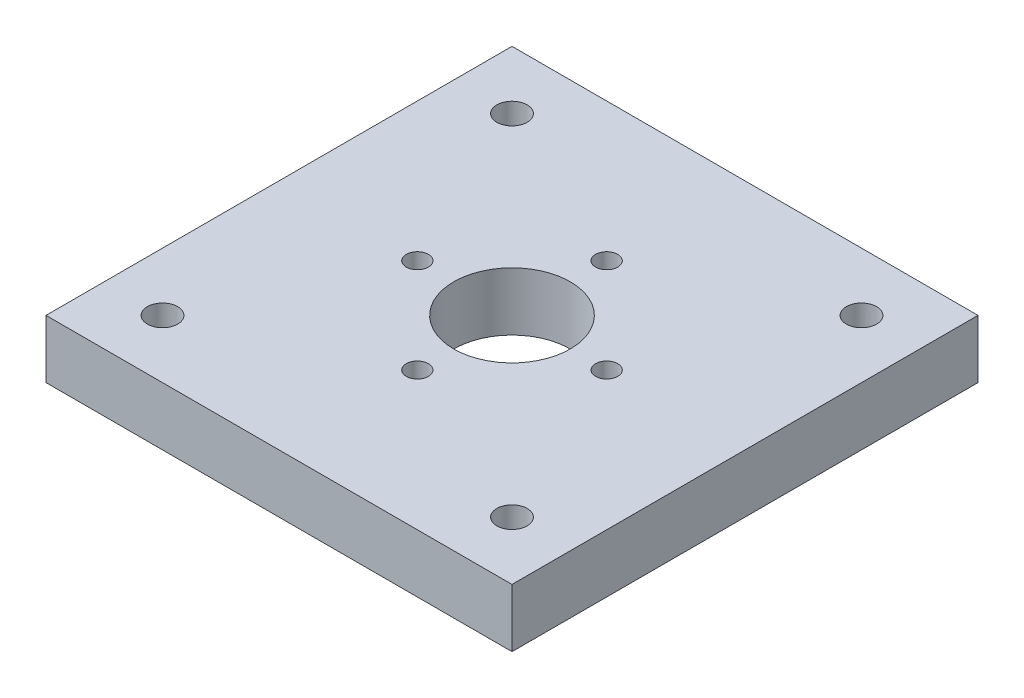
ISO-10303-21;
HEADER;
FILE_DESCRIPTION(('STEP AP214'),'2;1');
FILE_NAME('part.step','',(''),(''),'','','');
FILE_SCHEMA(('AUTOMOTIVE_DESIGN { 1 0 10303 214 1 1 1 1 }'));
ENDSEC;
DATA;
#1=APPLICATION_CONTEXT('core data for automotive mechanical design processes');
#2=APPLICATION_PROTOCOL_DEFINITION('international standard','automotive_design',2000,#1);
#3=PRODUCT_CONTEXT('',#1,'mechanical');
#4=PRODUCT('Part','Part','',(#3));
#5=PRODUCT_RELATED_PRODUCT_CATEGORY('part','',(#4));
#6=PRODUCT_DEFINITION_FORMATION('','',#4);
#7=PRODUCT_DEFINITION_CONTEXT('part definition',#1,'design');
#8=PRODUCT_DEFINITION('design','',#6,#7);
#9=PRODUCT_DEFINITION_SHAPE('','',#8);
#10=(LENGTH_UNIT() NAMED_UNIT(*) SI_UNIT(.MILLI.,.METRE.));
#11=(NAMED_UNIT(*) PLANE_ANGLE_UNIT() SI_UNIT($,.RADIAN.));
#12=(NAMED_UNIT(*) SI_UNIT($,.STERADIAN.) SOLID_ANGLE_UNIT());
#13=UNCERTAINTY_MEASURE_WITH_UNIT(LENGTH_MEASURE(1.E-05),#10,'distance_accuracy_value','');
#14=(GEOMETRIC_REPRESENTATION_CONTEXT(3) GLOBAL_UNCERTAINTY_ASSIGNED_CONTEXT((#13)) GLOBAL_UNIT_ASSIGNED_CONTEXT((#10,
#11,#12)) REPRESENTATION_CONTEXT('',''));
#15=CARTESIAN_POINT('',(0.,0.,0.));
#16=DIRECTION('',(0.,0.,1.));
#17=DIRECTION('',(1.,0.,0.));
#18=AXIS2_PLACEMENT_3D('',#15,#16,#17);
#19=CARTESIAN_POINT('',(0.,0.5,0.));
#20=DIRECTION('',(0.,1.,0.));
#21=DIRECTION('',(0.,0.,1.));
#22=AXIS2_PLACEMENT_3D('',#19,#20,#21);
#23=PLANE('',#22);
#24=CARTESIAN_POINT('',(0.,0.5,0.8125));
#25=DIRECTION('',(0.,1.,0.));
#26=DIRECTION('',(0.,0.,1.));
#27=AXIS2_PLACEMENT_3D('',#24,#25,#26);
#28=CIRCLE('',#27,0.095);
#29=CARTESIAN_POINT('',(0.,0.5,0.9075));
#30=VERTEX_POINT('',#29);
#31=EDGE_CURVE('E155',#30,#30,#28,.T.);
#32=ORIENTED_EDGE('',*,*,#31,.F.);
#33=EDGE_LOOP('',(#32));
#34=FACE_BOUND('',#33,.T.);
#35=CARTESIAN_POINT('',(0.,0.5,-0.8125));
#36=DIRECTION('',(0.,1.,0.));
#37=DIRECTION('',(0.,0.,1.));
#38=AXIS2_PLACEMENT_3D('',#35,#36,#37);
#39=CIRCLE('',#38,0.095);
#40=CARTESIAN_POINT('',(0.,0.5,-0.7175));
#41=VERTEX_POINT('',#40);
#42=EDGE_CURVE('E143',#41,#41,#39,.T.);
#43=ORIENTED_EDGE('',*,*,#42,.F.);
#44=EDGE_LOOP('',(#43));
#45=FACE_BOUND('',#44,.T.);
#46=CARTESIAN_POINT('',(1.5,0.5,-1.5));
#47=DIRECTION('',(0.,1.,0.));
#48=DIRECTION('',(0.,0.,-1.));
#49=AXIS2_PLACEMENT_3D('',#46,#47,#48);
#50=CIRCLE('',#49,0.13);
#51=CARTESIAN_POINT('',(1.5,0.5,-1.63));
#52=VERTEX_POINT('',#51);
#53=EDGE_CURVE('E131',#52,#52,#50,.T.);
#54=ORIENTED_EDGE('',*,*,#53,.F.);
#55=EDGE_LOOP('',(#54));
#56=FACE_BOUND('',#55,.T.);
#57=CARTESIAN_POINT('',(-1.5,0.5,1.5));
#58=DIRECTION('',(0.,1.,0.));
#59=DIRECTION('',(0.,0.,1.));
#60=AXIS2_PLACEMENT_3D('',#57,#58,#59);
#61=CIRCLE('',#60,0.13);
#62=CARTESIAN_POINT('',(-1.5,0.5,1.63));
#63=VERTEX_POINT('',#62);
#64=EDGE_CURVE('E119',#63,#63,#61,.T.);
#65=ORIENTED_EDGE('',*,*,#64,.F.);
#66=EDGE_LOOP('',(#65));
#67=FACE_BOUND('',#66,.T.);
#68=DIRECTION('',(0.,0.,-1.));
#69=VECTOR('',#68,1.);
#70=CARTESIAN_POINT('',(2.,0.5,-2.));
#71=LINE('',#70,#69);
#72=CARTESIAN_POINT('',(2.,0.5,2.));
#73=VERTEX_POINT('',#72);
#74=CARTESIAN_POINT('',(2.,0.5,-2.));
#75=VERTEX_POINT('',#74);
#76=EDGE_CURVE('E89',#73,#75,#71,.T.);
#77=ORIENTED_EDGE('',*,*,#76,.T.);
#78=DIRECTION('',(-1.,0.,0.));
#79=VECTOR('',#78,1.);
#80=CARTESIAN_POINT('',(-2.,0.5,-2.));
#81=LINE('',#80,#79);
#82=CARTESIAN_POINT('',(-2.,0.5,-2.));
#83=VERTEX_POINT('',#82);
#84=EDGE_CURVE('E84',#75,#83,#81,.T.);
#85=ORIENTED_EDGE('',*,*,#84,.T.);
#86=DIRECTION('',(0.,0.,1.));
#87=VECTOR('',#86,1.);
#88=CARTESIAN_POINT('',(-2.,0.5,-2.));
#89=LINE('',#88,#87);
#90=CARTESIAN_POINT('',(-2.,0.5,2.));
#91=VERTEX_POINT('',#90);
#92=EDGE_CURVE('E87',#83,#91,#89,.T.);
#93=ORIENTED_EDGE('',*,*,#92,.T.);
#94=DIRECTION('',(1.,0.,0.));
#95=VECTOR('',#94,1.);
#96=CARTESIAN_POINT('',(-2.,0.5,2.));
#97=LINE('',#96,#95);
#98=EDGE_CURVE('E54',#91,#73,#97,.T.);
#99=ORIENTED_EDGE('',*,*,#98,.T.);
#100=EDGE_LOOP('',(#77,#85,#93,#99));
#101=FACE_BOUND('',#100,.T.);
#102=CARTESIAN_POINT('',(-1.5,0.5,-1.5));
#103=DIRECTION('',(0.,1.,0.));
#104=DIRECTION('',(0.,0.,1.));
#105=AXIS2_PLACEMENT_3D('',#102,#103,#104);
#106=CIRCLE('',#105,0.13);
#107=CARTESIAN_POINT('',(-1.5,0.5,-1.37));
#108=VERTEX_POINT('',#107);
#109=EDGE_CURVE('E104',#108,#108,#106,.T.);
#110=ORIENTED_EDGE('',*,*,#109,.F.);
#111=EDGE_LOOP('',(#110));
#112=FACE_BOUND('',#111,.T.);
#113=CARTESIAN_POINT('',(1.5,0.5,1.5));
#114=DIRECTION('',(0.,1.,0.));
#115=DIRECTION('',(0.,0.,-1.));
#116=AXIS2_PLACEMENT_3D('',#113,#114,#115);
#117=CIRCLE('',#116,0.13);
#118=CARTESIAN_POINT('',(1.5,0.5,1.37));
#119=VERTEX_POINT('',#118);
#120=EDGE_CURVE('E125',#119,#119,#117,.T.);
#121=ORIENTED_EDGE('',*,*,#120,.F.);
#122=EDGE_LOOP('',(#121));
#123=FACE_BOUND('',#122,.T.);
#124=CARTESIAN_POINT('',(0.,0.5,0.));
#125=DIRECTION('',(0.,1.,0.));
#126=DIRECTION('',(0.,0.,1.));
#127=AXIS2_PLACEMENT_3D('',#124,#125,#126);
#128=CIRCLE('',#127,0.5);
#129=CARTESIAN_POINT('',(0.,0.5,0.5));
#130=VERTEX_POINT('',#129);
#131=EDGE_CURVE('E137',#130,#130,#128,.T.);
#132=ORIENTED_EDGE('',*,*,#131,.F.);
#133=EDGE_LOOP('',(#132));
#134=FACE_BOUND('',#133,.T.);
#135=CARTESIAN_POINT('',(0.8125,0.5,0.));
#136=DIRECTION('',(0.,1.,0.));
#137=DIRECTION('',(0.,0.,1.));
#138=AXIS2_PLACEMENT_3D('',#135,#136,#137);
#139=CIRCLE('',#138,0.095);
#140=CARTESIAN_POINT('',(0.8125,0.5,0.0950000000000028));
#141=VERTEX_POINT('',#140);
#142=EDGE_CURVE('E149',#141,#141,#139,.T.);
#143=ORIENTED_EDGE('',*,*,#142,.F.);
#144=EDGE_LOOP('',(#143));
#145=FACE_BOUND('',#144,.T.);
#146=CARTESIAN_POINT('',(-0.8125,0.5,0.));
#147=DIRECTION('',(0.,1.,0.));
#148=DIRECTION('',(0.,0.,1.));
#149=AXIS2_PLACEMENT_3D('',#146,#147,#148);
#150=CIRCLE('',#149,0.095);
#151=CARTESIAN_POINT('',(-0.8125,0.5,0.0949999999999915));
#152=VERTEX_POINT('',#151);
#153=EDGE_CURVE('E161',#152,#152,#150,.T.);
#154=ORIENTED_EDGE('',*,*,#153,.F.);
#155=EDGE_LOOP('',(#154));
#156=FACE_BOUND('',#155,.T.);
#157=ADVANCED_FACE('F37',(#34,#45,#56,#67,#101,#112,#123,#134,#145,#156),#23,.T.);
#158=CARTESIAN_POINT('',(0.,0.,0.));
#159=DIRECTION('',(0.,1.,0.));
#160=DIRECTION('',(0.,0.,1.));
#161=AXIS2_PLACEMENT_3D('',#158,#159,#160);
#162=PLANE('',#161);
#163=DIRECTION('',(0.,0.,-1.));
#164=VECTOR('',#163,1.);
#165=CARTESIAN_POINT('',(2.,0.,-2.));
#166=LINE('',#165,#164);
#167=CARTESIAN_POINT('',(2.,0.,2.));
#168=VERTEX_POINT('',#167);
#169=CARTESIAN_POINT('',(2.,0.,-2.));
#170=VERTEX_POINT('',#169);
#171=EDGE_CURVE('E101',#168,#170,#166,.T.);
#172=ORIENTED_EDGE('',*,*,#171,.F.);
#173=DIRECTION('',(1.,0.,0.));
#174=VECTOR('',#173,1.);
#175=CARTESIAN_POINT('',(-2.,0.,2.));
#176=LINE('',#175,#174);
#177=CARTESIAN_POINT('',(-2.,0.,2.));
#178=VERTEX_POINT('',#177);
#179=EDGE_CURVE('E77',#178,#168,#176,.T.);
#180=ORIENTED_EDGE('',*,*,#179,.F.);
#181=DIRECTION('',(0.,0.,1.));
#182=VECTOR('',#181,1.);
#183=CARTESIAN_POINT('',(-2.,0.,-2.));
#184=LINE('',#183,#182);
#185=CARTESIAN_POINT('',(-2.,0.,-2.));
#186=VERTEX_POINT('',#185);
#187=EDGE_CURVE('E71',#186,#178,#184,.T.);
#188=ORIENTED_EDGE('',*,*,#187,.F.);
#189=DIRECTION('',(-1.,0.,0.));
#190=VECTOR('',#189,1.);
#191=CARTESIAN_POINT('',(-2.,0.,-2.));
#192=LINE('',#191,#190);
#193=EDGE_CURVE('E93',#170,#186,#192,.T.);
#194=ORIENTED_EDGE('',*,*,#193,.F.);
#195=EDGE_LOOP('',(#172,#180,#188,#194));
#196=FACE_BOUND('',#195,.T.);
#197=CARTESIAN_POINT('',(-1.5,0.,-1.5));
#198=DIRECTION('',(0.,1.,0.));
#199=DIRECTION('',(0.,0.,1.));
#200=AXIS2_PLACEMENT_3D('',#197,#198,#199);
#201=CIRCLE('',#200,0.13);
#202=CARTESIAN_POINT('',(-1.5,0.,-1.37));
#203=VERTEX_POINT('',#202);
#204=EDGE_CURVE('E116',#203,#203,#201,.T.);
#205=ORIENTED_EDGE('',*,*,#204,.T.);
#206=EDGE_LOOP('',(#205));
#207=FACE_BOUND('',#206,.T.);
#208=CARTESIAN_POINT('',(-1.5,0.,1.5));
#209=DIRECTION('',(0.,1.,0.));
#210=DIRECTION('',(0.,0.,1.));
#211=AXIS2_PLACEMENT_3D('',#208,#209,#210);
#212=CIRCLE('',#211,0.13);
#213=CARTESIAN_POINT('',(-1.5,0.,1.63));
#214=VERTEX_POINT('',#213);
#215=EDGE_CURVE('E122',#214,#214,#212,.T.);
#216=ORIENTED_EDGE('',*,*,#215,.T.);
#217=EDGE_LOOP('',(#216));
#218=FACE_BOUND('',#217,.T.);
#219=CARTESIAN_POINT('',(1.5,0.,1.5));
#220=DIRECTION('',(0.,1.,0.));
#221=DIRECTION('',(0.,0.,-1.));
#222=AXIS2_PLACEMENT_3D('',#219,#220,#221);
#223=CIRCLE('',#222,0.13);
#224=CARTESIAN_POINT('',(1.5,0.,1.37));
#225=VERTEX_POINT('',#224);
#226=EDGE_CURVE('E128',#225,#225,#223,.T.);
#227=ORIENTED_EDGE('',*,*,#226,.T.);
#228=EDGE_LOOP('',(#227));
#229=FACE_BOUND('',#228,.T.);
#230=CARTESIAN_POINT('',(1.5,0.,-1.5));
#231=DIRECTION('',(0.,1.,0.));
#232=DIRECTION('',(0.,0.,-1.));
#233=AXIS2_PLACEMENT_3D('',#230,#231,#232);
#234=CIRCLE('',#233,0.13);
#235=CARTESIAN_POINT('',(1.5,0.,-1.63));
#236=VERTEX_POINT('',#235);
#237=EDGE_CURVE('E134',#236,#236,#234,.T.);
#238=ORIENTED_EDGE('',*,*,#237,.T.);
#239=EDGE_LOOP('',(#238));
#240=FACE_BOUND('',#239,.T.);
#241=CARTESIAN_POINT('',(0.,0.,0.));
#242=DIRECTION('',(0.,1.,0.));
#243=DIRECTION('',(0.,0.,1.));
#244=AXIS2_PLACEMENT_3D('',#241,#242,#243);
#245=CIRCLE('',#244,0.5);
#246=CARTESIAN_POINT('',(0.,0.,0.5));
#247=VERTEX_POINT('',#246);
#248=EDGE_CURVE('E140',#247,#247,#245,.T.);
#249=ORIENTED_EDGE('',*,*,#248,.T.);
#250=EDGE_LOOP('',(#249));
#251=FACE_BOUND('',#250,.T.);
#252=CARTESIAN_POINT('',(0.,0.,-0.8125));
#253=DIRECTION('',(0.,1.,0.));
#254=DIRECTION('',(0.,0.,1.));
#255=AXIS2_PLACEMENT_3D('',#252,#253,#254);
#256=CIRCLE('',#255,0.095);
#257=CARTESIAN_POINT('',(0.,0.,-0.7175));
#258=VERTEX_POINT('',#257);
#259=EDGE_CURVE('E146',#258,#258,#256,.T.);
#260=ORIENTED_EDGE('',*,*,#259,.T.);
#261=EDGE_LOOP('',(#260));
#262=FACE_BOUND('',#261,.T.);
#263=CARTESIAN_POINT('',(0.8125,0.,0.));
#264=DIRECTION('',(0.,1.,0.));
#265=DIRECTION('',(0.,0.,1.));
#266=AXIS2_PLACEMENT_3D('',#263,#264,#265);
#267=CIRCLE('',#266,0.095);
#268=CARTESIAN_POINT('',(0.8125,0.,0.0950000000000028));
#269=VERTEX_POINT('',#268);
#270=EDGE_CURVE('E152',#269,#269,#267,.T.);
#271=ORIENTED_EDGE('',*,*,#270,.T.);
#272=EDGE_LOOP('',(#271));
#273=FACE_BOUND('',#272,.T.);
#274=CARTESIAN_POINT('',(0.,0.,0.8125));
#275=DIRECTION('',(0.,1.,0.));
#276=DIRECTION('',(0.,0.,1.));
#277=AXIS2_PLACEMENT_3D('',#274,#275,#276);
#278=CIRCLE('',#277,0.095);
#279=CARTESIAN_POINT('',(0.,0.,0.9075));
#280=VERTEX_POINT('',#279);
#281=EDGE_CURVE('E158',#280,#280,#278,.T.);
#282=ORIENTED_EDGE('',*,*,#281,.T.);
#283=EDGE_LOOP('',(#282));
#284=FACE_BOUND('',#283,.T.);
#285=CARTESIAN_POINT('',(-0.8125,0.,0.));
#286=DIRECTION('',(0.,1.,0.));
#287=DIRECTION('',(0.,0.,1.));
#288=AXIS2_PLACEMENT_3D('',#285,#286,#287);
#289=CIRCLE('',#288,0.095);
#290=CARTESIAN_POINT('',(-0.8125,0.,0.0949999999999915));
#291=VERTEX_POINT('',#290);
#292=EDGE_CURVE('E164',#291,#291,#289,.T.);
#293=ORIENTED_EDGE('',*,*,#292,.T.);
#294=EDGE_LOOP('',(#293));
#295=FACE_BOUND('',#294,.T.);
#296=ADVANCED_FACE('F112',(#196,#207,#218,#229,#240,#251,#262,#273,#284,#295),#162,.F.);
#297=CARTESIAN_POINT('',(2.,0.5,-2.));
#298=DIRECTION('',(-1.,0.,0.));
#299=DIRECTION('',(0.,0.,1.));
#300=AXIS2_PLACEMENT_3D('',#297,#298,#299);
#301=PLANE('',#300);
#302=ORIENTED_EDGE('',*,*,#171,.T.);
#303=DIRECTION('',(0.,-1.,0.));
#304=VECTOR('',#303,1.);
#305=CARTESIAN_POINT('',(2.,0.5,-2.));
#306=LINE('',#305,#304);
#307=EDGE_CURVE('E11',#75,#170,#306,.T.);
#308=ORIENTED_EDGE('',*,*,#307,.F.);
#309=ORIENTED_EDGE('',*,*,#76,.F.);
#310=DIRECTION('',(0.,-1.,0.));
#311=VECTOR('',#310,1.);
#312=CARTESIAN_POINT('',(2.,0.5,2.));
#313=LINE('',#312,#311);
#314=EDGE_CURVE('E97',#73,#168,#313,.T.);
#315=ORIENTED_EDGE('',*,*,#314,.T.);
#316=EDGE_LOOP('',(#302,#308,#309,#315));
#317=FACE_BOUND('',#316,.T.);
#318=ADVANCED_FACE('F39',(#317),#301,.F.);
#319=CARTESIAN_POINT('',(-2.,0.5,-2.));
#320=DIRECTION('',(0.,0.,1.));
#321=DIRECTION('',(1.,0.,0.));
#322=AXIS2_PLACEMENT_3D('',#319,#320,#321);
#323=PLANE('',#322);
#324=ORIENTED_EDGE('',*,*,#193,.T.);
#325=DIRECTION('',(0.,-1.,0.));
#326=VECTOR('',#325,1.);
#327=CARTESIAN_POINT('',(-2.,0.5,-2.));
#328=LINE('',#327,#326);
#329=EDGE_CURVE('E46',#83,#186,#328,.T.);
#330=ORIENTED_EDGE('',*,*,#329,.F.);
#331=ORIENTED_EDGE('',*,*,#84,.F.);
#332=ORIENTED_EDGE('',*,*,#307,.T.);
#333=EDGE_LOOP('',(#324,#330,#331,#332));
#334=FACE_BOUND('',#333,.T.);
#335=ADVANCED_FACE('F92',(#334),#323,.F.);
#336=CARTESIAN_POINT('',(-2.,0.5,-2.));
#337=DIRECTION('',(1.,0.,0.));
#338=DIRECTION('',(0.,0.,-1.));
#339=AXIS2_PLACEMENT_3D('',#336,#337,#338);
#340=PLANE('',#339);
#341=ORIENTED_EDGE('',*,*,#187,.T.);
#342=DIRECTION('',(0.,-1.,0.));
#343=VECTOR('',#342,1.);
#344=CARTESIAN_POINT('',(-2.,0.5,2.));
#345=LINE('',#344,#343);
#346=EDGE_CURVE('E94',#91,#178,#345,.T.);
#347=ORIENTED_EDGE('',*,*,#346,.F.);
#348=ORIENTED_EDGE('',*,*,#92,.F.);
#349=ORIENTED_EDGE('',*,*,#329,.T.);
#350=EDGE_LOOP('',(#341,#347,#348,#349));
#351=FACE_BOUND('',#350,.T.);
#352=ADVANCED_FACE('F95',(#351),#340,.F.);
#353=CARTESIAN_POINT('',(-2.,0.5,2.));
#354=DIRECTION('',(0.,0.,-1.));
#355=DIRECTION('',(-1.,0.,0.));
#356=AXIS2_PLACEMENT_3D('',#353,#354,#355);
#357=PLANE('',#356);
#358=ORIENTED_EDGE('',*,*,#179,.T.);
#359=ORIENTED_EDGE('',*,*,#314,.F.);
#360=ORIENTED_EDGE('',*,*,#98,.F.);
#361=ORIENTED_EDGE('',*,*,#346,.T.);
#362=EDGE_LOOP('',(#358,#359,#360,#361));
#363=FACE_BOUND('',#362,.T.);
#364=ADVANCED_FACE('F109',(#363),#357,.F.);
#365=CARTESIAN_POINT('',(-1.5,0.5,-1.5));
#366=DIRECTION('',(0.,-1.,0.));
#367=DIRECTION('',(0.,0.,-1.));
#368=AXIS2_PLACEMENT_3D('',#365,#366,#367);
#369=CYLINDRICAL_SURFACE('',#368,0.13);
#370=ORIENTED_EDGE('',*,*,#109,.T.);
#371=EDGE_LOOP('',(#370));
#372=FACE_BOUND('',#371,.T.);
#373=ORIENTED_EDGE('',*,*,#204,.F.);
#374=EDGE_LOOP('',(#373));
#375=FACE_BOUND('',#374,.T.);
#376=ADVANCED_FACE('F183',(#372,#375),#369,.F.);
#377=CARTESIAN_POINT('',(-1.5,0.5,1.5));
#378=DIRECTION('',(0.,-1.,0.));
#379=DIRECTION('',(0.,0.,-1.));
#380=AXIS2_PLACEMENT_3D('',#377,#378,#379);
#381=CYLINDRICAL_SURFACE('',#380,0.13);
#382=ORIENTED_EDGE('',*,*,#64,.T.);
#383=EDGE_LOOP('',(#382));
#384=FACE_BOUND('',#383,.T.);
#385=ORIENTED_EDGE('',*,*,#215,.F.);
#386=EDGE_LOOP('',(#385));
#387=FACE_BOUND('',#386,.T.);
#388=ADVANCED_FACE('F237',(#384,#387),#381,.F.);
#389=CARTESIAN_POINT('',(1.5,0.5,1.5));
#390=DIRECTION('',(0.,-1.,0.));
#391=DIRECTION('',(0.,0.,-1.));
#392=AXIS2_PLACEMENT_3D('',#389,#390,#391);
#393=CYLINDRICAL_SURFACE('',#392,0.13);
#394=ORIENTED_EDGE('',*,*,#120,.T.);
#395=EDGE_LOOP('',(#394));
#396=FACE_BOUND('',#395,.T.);
#397=ORIENTED_EDGE('',*,*,#226,.F.);
#398=EDGE_LOOP('',(#397));
#399=FACE_BOUND('',#398,.T.);
#400=ADVANCED_FACE('F246',(#396,#399),#393,.F.);
#401=CARTESIAN_POINT('',(1.5,0.5,-1.5));
#402=DIRECTION('',(0.,-1.,0.));
#403=DIRECTION('',(0.,0.,-1.));
#404=AXIS2_PLACEMENT_3D('',#401,#402,#403);
#405=CYLINDRICAL_SURFACE('',#404,0.13);
#406=ORIENTED_EDGE('',*,*,#53,.T.);
#407=EDGE_LOOP('',(#406));
#408=FACE_BOUND('',#407,.T.);
#409=ORIENTED_EDGE('',*,*,#237,.F.);
#410=EDGE_LOOP('',(#409));
#411=FACE_BOUND('',#410,.T.);
#412=ADVANCED_FACE('F255',(#408,#411),#405,.F.);
#413=CARTESIAN_POINT('',(0.,0.5,0.));
#414=DIRECTION('',(0.,-1.,0.));
#415=DIRECTION('',(0.,0.,-1.));
#416=AXIS2_PLACEMENT_3D('',#413,#414,#415);
#417=CYLINDRICAL_SURFACE('',#416,0.5);
#418=ORIENTED_EDGE('',*,*,#131,.T.);
#419=EDGE_LOOP('',(#418));
#420=FACE_BOUND('',#419,.T.);
#421=ORIENTED_EDGE('',*,*,#248,.F.);
#422=EDGE_LOOP('',(#421));
#423=FACE_BOUND('',#422,.T.);
#424=ADVANCED_FACE('F265',(#420,#423),#417,.F.);
#425=CARTESIAN_POINT('',(0.,0.5,-0.8125));
#426=DIRECTION('',(0.,-1.,0.));
#427=DIRECTION('',(0.,0.,-1.));
#428=AXIS2_PLACEMENT_3D('',#425,#426,#427);
#429=CYLINDRICAL_SURFACE('',#428,0.095);
#430=ORIENTED_EDGE('',*,*,#42,.T.);
#431=EDGE_LOOP('',(#430));
#432=FACE_BOUND('',#431,.T.);
#433=ORIENTED_EDGE('',*,*,#259,.F.);
#434=EDGE_LOOP('',(#433));
#435=FACE_BOUND('',#434,.T.);
#436=ADVANCED_FACE('F275',(#432,#435),#429,.F.);
#437=CARTESIAN_POINT('',(0.8125,0.5,0.));
#438=DIRECTION('',(0.,-1.,0.));
#439=DIRECTION('',(0.,0.,-1.));
#440=AXIS2_PLACEMENT_3D('',#437,#438,#439);
#441=CYLINDRICAL_SURFACE('',#440,0.095);
#442=ORIENTED_EDGE('',*,*,#142,.T.);
#443=EDGE_LOOP('',(#442));
#444=FACE_BOUND('',#443,.T.);
#445=ORIENTED_EDGE('',*,*,#270,.F.);
#446=EDGE_LOOP('',(#445));
#447=FACE_BOUND('',#446,.T.);
#448=ADVANCED_FACE('F285',(#444,#447),#441,.F.);
#449=CARTESIAN_POINT('',(0.,0.5,0.8125));
#450=DIRECTION('',(0.,-1.,0.));
#451=DIRECTION('',(0.,0.,-1.));
#452=AXIS2_PLACEMENT_3D('',#449,#450,#451);
#453=CYLINDRICAL_SURFACE('',#452,0.095);
#454=ORIENTED_EDGE('',*,*,#31,.T.);
#455=EDGE_LOOP('',(#454));
#456=FACE_BOUND('',#455,.T.);
#457=ORIENTED_EDGE('',*,*,#281,.F.);
#458=EDGE_LOOP('',(#457));
#459=FACE_BOUND('',#458,.T.);
#460=ADVANCED_FACE('F295',(#456,#459),#453,.F.);
#461=CARTESIAN_POINT('',(-0.8125,0.5,0.));
#462=DIRECTION('',(0.,-1.,0.));
#463=DIRECTION('',(0.,0.,-1.));
#464=AXIS2_PLACEMENT_3D('',#461,#462,#463);
#465=CYLINDRICAL_SURFACE('',#464,0.095);
#466=ORIENTED_EDGE('',*,*,#153,.T.);
#467=EDGE_LOOP('',(#466));
#468=FACE_BOUND('',#467,.T.);
#469=ORIENTED_EDGE('',*,*,#292,.F.);
#470=EDGE_LOOP('',(#469));
#471=FACE_BOUND('',#470,.T.);
#472=ADVANCED_FACE('F170',(#468,#471),#465,.F.);
#473=CLOSED_SHELL('',(#157,#296,#318,#335,#352,#364,#376,#388,#400,#412,#424,#436,#448,#460,#472));
#474=MANIFOLD_SOLID_BREP('B2',#473);
#475=ADVANCED_BREP_SHAPE_REPRESENTATION('',(#18,#474),#14);
#476=SHAPE_DEFINITION_REPRESENTATION(#9,#475);
ENDSEC;
END-ISO-10303-21;
